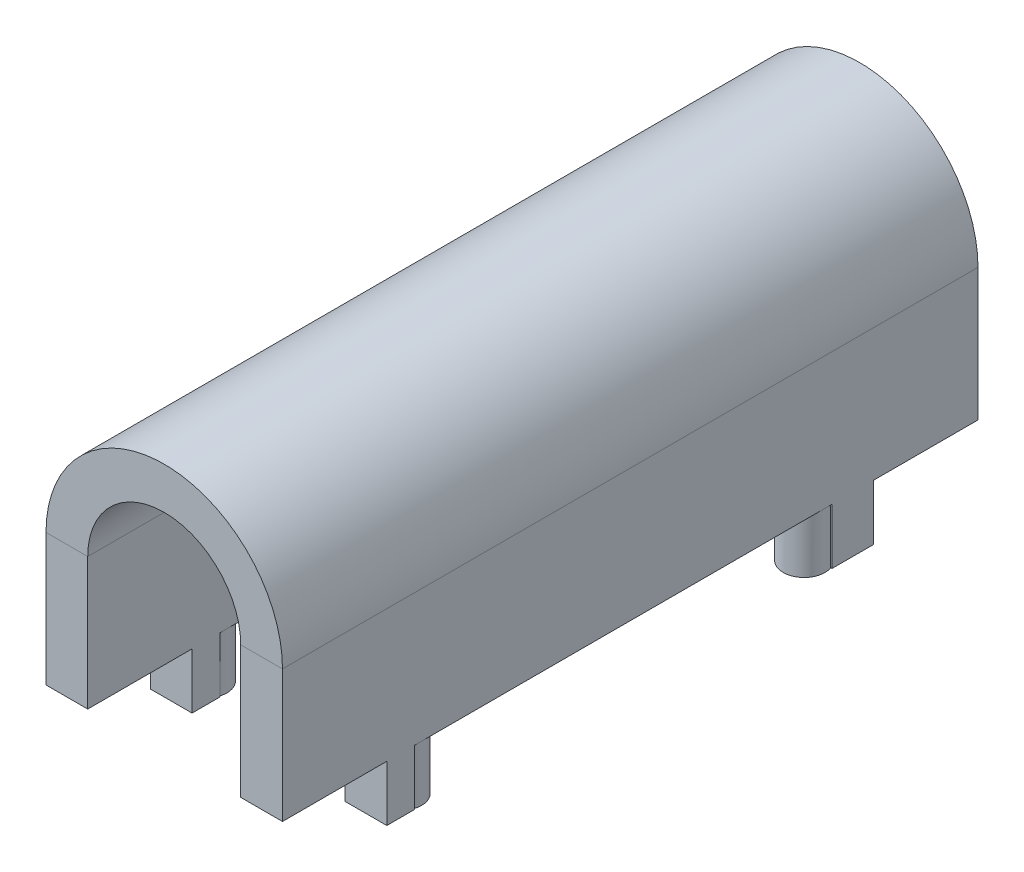
ISO-10303-21;
HEADER;
FILE_DESCRIPTION(('STEP AP214'),'2;1');
FILE_NAME('part.step','',(''),(''),'','','');
FILE_SCHEMA(('AUTOMOTIVE_DESIGN { 1 0 10303 214 1 1 1 1 }'));
ENDSEC;
DATA;
#1=APPLICATION_CONTEXT('core data for automotive mechanical design processes');
#2=APPLICATION_PROTOCOL_DEFINITION('international standard','automotive_design',2000,#1);
#3=PRODUCT_CONTEXT('',#1,'mechanical');
#4=PRODUCT('Part','Part','',(#3));
#5=PRODUCT_RELATED_PRODUCT_CATEGORY('part','',(#4));
#6=PRODUCT_DEFINITION_FORMATION('','',#4);
#7=PRODUCT_DEFINITION_CONTEXT('part definition',#1,'design');
#8=PRODUCT_DEFINITION('design','',#6,#7);
#9=PRODUCT_DEFINITION_SHAPE('','',#8);
#10=(LENGTH_UNIT() NAMED_UNIT(*) SI_UNIT(.MILLI.,.METRE.));
#11=(NAMED_UNIT(*) PLANE_ANGLE_UNIT() SI_UNIT($,.RADIAN.));
#12=(NAMED_UNIT(*) SI_UNIT($,.STERADIAN.) SOLID_ANGLE_UNIT());
#13=UNCERTAINTY_MEASURE_WITH_UNIT(LENGTH_MEASURE(1.E-05),#10,'distance_accuracy_value','');
#14=(GEOMETRIC_REPRESENTATION_CONTEXT(3) GLOBAL_UNCERTAINTY_ASSIGNED_CONTEXT((#13)) GLOBAL_UNIT_ASSIGNED_CONTEXT((#10,
#11,#12)) REPRESENTATION_CONTEXT('',''));
#15=CARTESIAN_POINT('',(0.,0.,0.));
#16=DIRECTION('',(0.,0.,1.));
#17=DIRECTION('',(1.,0.,0.));
#18=AXIS2_PLACEMENT_3D('',#15,#16,#17);
#19=CARTESIAN_POINT('',(5.75,-4.75,20.25));
#20=DIRECTION('',(0.,0.,1.));
#21=DIRECTION('',(1.,0.,0.));
#22=AXIS2_PLACEMENT_3D('',#19,#20,#21);
#23=PLANE('',#22);
#24=DIRECTION('',(0.,1.,0.));
#25=VECTOR('',#24,1.);
#26=CARTESIAN_POINT('',(4.20710678118655,-8.87132034355965,20.25));
#27=LINE('',#26,#25);
#28=CARTESIAN_POINT('',(4.20710678118655,-4.75,20.25));
#29=VERTEX_POINT('',#28);
#30=CARTESIAN_POINT('',(4.20710678118655,-6.75,20.25));
#31=VERTEX_POINT('',#30);
#32=EDGE_CURVE('E523',#29,#31,#27,.F.);
#33=ORIENTED_EDGE('',*,*,#32,.F.);
#34=DIRECTION('',(-1.,0.,0.));
#35=VECTOR('',#34,1.);
#36=CARTESIAN_POINT('',(5.75,-4.75,20.25));
#37=LINE('',#36,#35);
#38=CARTESIAN_POINT('',(4.25,-4.75,20.25));
#39=VERTEX_POINT('',#38);
#40=EDGE_CURVE('E455',#39,#29,#37,.T.);
#41=ORIENTED_EDGE('',*,*,#40,.F.);
#42=DIRECTION('',(0.,1.,0.));
#43=VECTOR('',#42,1.);
#44=CARTESIAN_POINT('',(4.25,-6.75,20.25));
#45=LINE('',#44,#43);
#46=CARTESIAN_POINT('',(4.25,-6.75,20.25));
#47=VERTEX_POINT('',#46);
#48=EDGE_CURVE('E327',#47,#39,#45,.T.);
#49=ORIENTED_EDGE('',*,*,#48,.F.);
#50=DIRECTION('',(-1.,0.,0.));
#51=VECTOR('',#50,1.);
#52=CARTESIAN_POINT('',(5.75,-6.75,20.25));
#53=LINE('',#52,#51);
#54=EDGE_CURVE('E58',#47,#31,#53,.T.);
#55=ORIENTED_EDGE('',*,*,#54,.T.);
#56=EDGE_LOOP('',(#33,#41,#49,#55));
#57=FACE_BOUND('',#56,.T.);
#58=ADVANCED_FACE('F35',(#57),#23,.F.);
#59=DIRECTION('',(0.,1.,0.));
#60=VECTOR('',#59,1.);
#61=CARTESIAN_POINT('',(2.79289321881345,-8.87132034355965,20.25));
#62=LINE('',#61,#60);
#63=CARTESIAN_POINT('',(2.79289321881345,-6.75,20.25));
#64=VERTEX_POINT('',#63);
#65=CARTESIAN_POINT('',(2.79289321881345,-4.75,20.25));
#66=VERTEX_POINT('',#65);
#67=EDGE_CURVE('E50',#64,#66,#62,.T.);
#68=ORIENTED_EDGE('',*,*,#67,.F.);
#69=CARTESIAN_POINT('',(2.75,-6.75,20.25));
#70=VERTEX_POINT('',#69);
#71=EDGE_CURVE('E449',#64,#70,#53,.T.);
#72=ORIENTED_EDGE('',*,*,#71,.T.);
#73=DIRECTION('',(0.,1.,0.));
#74=VECTOR('',#73,1.);
#75=CARTESIAN_POINT('',(2.75,-6.75,20.25));
#76=LINE('',#75,#74);
#77=CARTESIAN_POINT('',(2.75,-4.75,20.25));
#78=VERTEX_POINT('',#77);
#79=EDGE_CURVE('E444',#70,#78,#76,.T.);
#80=ORIENTED_EDGE('',*,*,#79,.T.);
#81=EDGE_CURVE('E273',#66,#78,#37,.T.);
#82=ORIENTED_EDGE('',*,*,#81,.F.);
#83=EDGE_LOOP('',(#68,#72,#80,#82));
#84=FACE_BOUND('',#83,.T.);
#85=ADVANCED_FACE('F639',(#84),#23,.F.);
#86=CARTESIAN_POINT('',(5.75,-4.75,5.25));
#87=DIRECTION('',(0.,1.,0.));
#88=DIRECTION('',(-1.,0.,0.));
#89=AXIS2_PLACEMENT_3D('',#86,#87,#88);
#90=PLANE('',#89);
#91=CARTESIAN_POINT('',(3.5,-4.75,20.));
#92=DIRECTION('',(0.,-1.,0.));
#93=DIRECTION('',(1.,0.,0.));
#94=AXIS2_PLACEMENT_3D('',#91,#92,#93);
#95=CIRCLE('',#94,0.750000000000002);
#96=CARTESIAN_POINT('',(4.25,-4.75,20.));
#97=VERTEX_POINT('',#96);
#98=EDGE_CURVE('E529',#97,#29,#95,.T.);
#99=ORIENTED_EDGE('',*,*,#98,.F.);
#100=DIRECTION('',(0.,0.,-1.));
#101=VECTOR('',#100,1.);
#102=CARTESIAN_POINT('',(4.25,-4.75,25.));
#103=LINE('',#102,#101);
#104=EDGE_CURVE('E324',#39,#97,#103,.T.);
#105=ORIENTED_EDGE('',*,*,#104,.F.);
#106=ORIENTED_EDGE('',*,*,#40,.T.);
#107=EDGE_LOOP('',(#99,#105,#106));
#108=FACE_BOUND('',#107,.T.);
#109=ADVANCED_FACE('F533',(#108),#90,.F.);
#110=CARTESIAN_POINT('',(3.5,-4.75,20.));
#111=DIRECTION('',(0.,1.,0.));
#112=DIRECTION('',(-1.,0.,0.));
#113=AXIS2_PLACEMENT_3D('',#110,#111,#112);
#114=CIRCLE('',#113,0.750000000000002);
#115=CARTESIAN_POINT('',(2.75,-4.75,20.));
#116=VERTEX_POINT('',#115);
#117=EDGE_CURVE('E11',#116,#97,#114,.F.);
#118=ORIENTED_EDGE('',*,*,#117,.F.);
#119=DIRECTION('',(0.,0.,-1.));
#120=VECTOR('',#119,1.);
#121=CARTESIAN_POINT('',(2.75,-4.75,25.));
#122=LINE('',#121,#120);
#123=CARTESIAN_POINT('',(2.75,-4.75,5.5));
#124=VERTEX_POINT('',#123);
#125=EDGE_CURVE('E278',#116,#124,#122,.T.);
#126=ORIENTED_EDGE('',*,*,#125,.T.);
#127=CARTESIAN_POINT('',(3.5,-4.75,5.5));
#128=DIRECTION('',(0.,-1.,0.));
#129=DIRECTION('',(1.,0.,0.));
#130=AXIS2_PLACEMENT_3D('',#127,#128,#129);
#131=CIRCLE('',#130,0.750000000000002);
#132=CARTESIAN_POINT('',(4.25,-4.75,5.5));
#133=VERTEX_POINT('',#132);
#134=EDGE_CURVE('E519',#133,#124,#131,.T.);
#135=ORIENTED_EDGE('',*,*,#134,.F.);
#136=EDGE_CURVE('E291',#97,#133,#103,.T.);
#137=ORIENTED_EDGE('',*,*,#136,.F.);
#138=EDGE_LOOP('',(#118,#126,#135,#137));
#139=FACE_BOUND('',#138,.T.);
#140=ADVANCED_FACE('F290',(#139),#90,.F.);
#141=CARTESIAN_POINT('',(2.79289321881345,-4.75,5.25));
#142=VERTEX_POINT('',#141);
#143=EDGE_CURVE('E521',#124,#142,#131,.T.);
#144=ORIENTED_EDGE('',*,*,#143,.F.);
#145=CARTESIAN_POINT('',(2.75,-4.75,5.25));
#146=VERTEX_POINT('',#145);
#147=EDGE_CURVE('E280',#124,#146,#122,.T.);
#148=ORIENTED_EDGE('',*,*,#147,.T.);
#149=DIRECTION('',(-1.,0.,0.));
#150=VECTOR('',#149,1.);
#151=CARTESIAN_POINT('',(5.75,-4.75,5.25));
#152=LINE('',#151,#150);
#153=EDGE_CURVE('E459',#142,#146,#152,.T.);
#154=ORIENTED_EDGE('',*,*,#153,.F.);
#155=EDGE_LOOP('',(#144,#148,#154));
#156=FACE_BOUND('',#155,.T.);
#157=ADVANCED_FACE('F815',(#156),#90,.F.);
#158=CARTESIAN_POINT('',(4.20710678118655,-4.75,5.25));
#159=VERTEX_POINT('',#158);
#160=EDGE_CURVE('E522',#159,#133,#131,.T.);
#161=ORIENTED_EDGE('',*,*,#160,.F.);
#162=CARTESIAN_POINT('',(4.25,-4.75,5.25));
#163=VERTEX_POINT('',#162);
#164=EDGE_CURVE('E461',#163,#159,#152,.T.);
#165=ORIENTED_EDGE('',*,*,#164,.F.);
#166=EDGE_CURVE('E326',#133,#163,#103,.T.);
#167=ORIENTED_EDGE('',*,*,#166,.F.);
#168=EDGE_LOOP('',(#161,#165,#167));
#169=FACE_BOUND('',#168,.T.);
#170=ADVANCED_FACE('F808',(#169),#90,.F.);
#171=CARTESIAN_POINT('',(5.75,-6.75,5.25));
#172=DIRECTION('',(0.,0.,-1.));
#173=DIRECTION('',(-1.,0.,0.));
#174=AXIS2_PLACEMENT_3D('',#171,#172,#173);
#175=PLANE('',#174);
#176=DIRECTION('',(0.,1.,0.));
#177=VECTOR('',#176,1.);
#178=CARTESIAN_POINT('',(2.79289321881345,-8.87132034355965,5.25));
#179=LINE('',#178,#177);
#180=CARTESIAN_POINT('',(2.79289321881345,-6.75,5.25));
#181=VERTEX_POINT('',#180);
#182=EDGE_CURVE('E297',#142,#181,#179,.F.);
#183=ORIENTED_EDGE('',*,*,#182,.F.);
#184=ORIENTED_EDGE('',*,*,#153,.T.);
#185=DIRECTION('',(0.,-1.,0.));
#186=VECTOR('',#185,1.);
#187=CARTESIAN_POINT('',(2.75,-6.75,5.25));
#188=LINE('',#187,#186);
#189=CARTESIAN_POINT('',(2.75,-6.75,5.25));
#190=VERTEX_POINT('',#189);
#191=EDGE_CURVE('E434',#146,#190,#188,.T.);
#192=ORIENTED_EDGE('',*,*,#191,.T.);
#193=DIRECTION('',(-1.,0.,0.));
#194=VECTOR('',#193,1.);
#195=CARTESIAN_POINT('',(5.75,-6.75,5.25));
#196=LINE('',#195,#194);
#197=EDGE_CURVE('E465',#181,#190,#196,.T.);
#198=ORIENTED_EDGE('',*,*,#197,.F.);
#199=EDGE_LOOP('',(#183,#184,#192,#198));
#200=FACE_BOUND('',#199,.T.);
#201=ADVANCED_FACE('F804',(#200),#175,.F.);
#202=DIRECTION('',(0.,1.,0.));
#203=VECTOR('',#202,1.);
#204=CARTESIAN_POINT('',(4.20710678118655,-8.87132034355965,5.25));
#205=LINE('',#204,#203);
#206=CARTESIAN_POINT('',(4.20710678118655,-6.75,5.25));
#207=VERTEX_POINT('',#206);
#208=EDGE_CURVE('E299',#207,#159,#205,.T.);
#209=ORIENTED_EDGE('',*,*,#208,.F.);
#210=CARTESIAN_POINT('',(4.25,-6.75,5.25));
#211=VERTEX_POINT('',#210);
#212=EDGE_CURVE('E446',#211,#207,#196,.T.);
#213=ORIENTED_EDGE('',*,*,#212,.F.);
#214=DIRECTION('',(0.,-1.,0.));
#215=VECTOR('',#214,1.);
#216=CARTESIAN_POINT('',(4.25,-6.75,5.25));
#217=LINE('',#216,#215);
#218=EDGE_CURVE('E321',#163,#211,#217,.T.);
#219=ORIENTED_EDGE('',*,*,#218,.F.);
#220=ORIENTED_EDGE('',*,*,#164,.T.);
#221=EDGE_LOOP('',(#209,#213,#219,#220));
#222=FACE_BOUND('',#221,.T.);
#223=ADVANCED_FACE('F634',(#222),#175,.F.);
#224=CARTESIAN_POINT('',(-3.5,-4.75,5.5));
#225=DIRECTION('',(0.,-1.,0.));
#226=DIRECTION('',(1.,0.,0.));
#227=AXIS2_PLACEMENT_3D('',#224,#225,#226);
#228=CIRCLE('',#227,0.75);
#229=CARTESIAN_POINT('',(-4.25,-4.75,5.5));
#230=VERTEX_POINT('',#229);
#231=CARTESIAN_POINT('',(-4.20710678118655,-4.75,5.25));
#232=VERTEX_POINT('',#231);
#233=EDGE_CURVE('E515',#230,#232,#228,.T.);
#234=ORIENTED_EDGE('',*,*,#233,.F.);
#235=DIRECTION('',(0.,0.,-1.));
#236=VECTOR('',#235,1.);
#237=CARTESIAN_POINT('',(-4.25,-4.75,5.25));
#238=LINE('',#237,#236);
#239=CARTESIAN_POINT('',(-4.25,-4.75,5.25));
#240=VERTEX_POINT('',#239);
#241=EDGE_CURVE('E474',#230,#240,#238,.T.);
#242=ORIENTED_EDGE('',*,*,#241,.T.);
#243=EDGE_CURVE('E460',#232,#240,#152,.T.);
#244=ORIENTED_EDGE('',*,*,#243,.F.);
#245=EDGE_LOOP('',(#234,#242,#244));
#246=FACE_BOUND('',#245,.T.);
#247=ADVANCED_FACE('F616',(#246),#90,.F.);
#248=CARTESIAN_POINT('',(-2.79289321881345,-4.75,5.25));
#249=VERTEX_POINT('',#248);
#250=CARTESIAN_POINT('',(-2.75,-4.75,5.5));
#251=VERTEX_POINT('',#250);
#252=EDGE_CURVE('E516',#249,#251,#228,.T.);
#253=ORIENTED_EDGE('',*,*,#252,.F.);
#254=CARTESIAN_POINT('',(-2.75,-4.75,5.25));
#255=VERTEX_POINT('',#254);
#256=EDGE_CURVE('E456',#255,#249,#152,.T.);
#257=ORIENTED_EDGE('',*,*,#256,.F.);
#258=DIRECTION('',(0.,0.,1.));
#259=VECTOR('',#258,1.);
#260=CARTESIAN_POINT('',(-2.75,-4.75,25.));
#261=LINE('',#260,#259);
#262=EDGE_CURVE('E437',#255,#251,#261,.T.);
#263=ORIENTED_EDGE('',*,*,#262,.T.);
#264=EDGE_LOOP('',(#253,#257,#263));
#265=FACE_BOUND('',#264,.T.);
#266=ADVANCED_FACE('F627',(#265),#90,.F.);
#267=DIRECTION('',(0.,1.,0.));
#268=VECTOR('',#267,1.);
#269=CARTESIAN_POINT('',(-4.20710678118655,-8.87132034355965,5.25));
#270=LINE('',#269,#268);
#271=CARTESIAN_POINT('',(-4.20710678118655,-6.75,5.25));
#272=VERTEX_POINT('',#271);
#273=EDGE_CURVE('E303',#232,#272,#270,.F.);
#274=ORIENTED_EDGE('',*,*,#273,.F.);
#275=ORIENTED_EDGE('',*,*,#243,.T.);
#276=DIRECTION('',(0.,-1.,0.));
#277=VECTOR('',#276,1.);
#278=CARTESIAN_POINT('',(-4.25,-6.75,5.25));
#279=LINE('',#278,#277);
#280=CARTESIAN_POINT('',(-4.25,-6.75,5.25));
#281=VERTEX_POINT('',#280);
#282=EDGE_CURVE('E467',#240,#281,#279,.T.);
#283=ORIENTED_EDGE('',*,*,#282,.T.);
#284=EDGE_CURVE('E466',#272,#281,#196,.T.);
#285=ORIENTED_EDGE('',*,*,#284,.F.);
#286=EDGE_LOOP('',(#274,#275,#283,#285));
#287=FACE_BOUND('',#286,.T.);
#288=ADVANCED_FACE('F612',(#287),#175,.F.);
#289=DIRECTION('',(0.,1.,0.));
#290=VECTOR('',#289,1.);
#291=CARTESIAN_POINT('',(-2.79289321881345,-8.87132034355965,5.25));
#292=LINE('',#291,#290);
#293=CARTESIAN_POINT('',(-2.79289321881345,-6.75,5.25));
#294=VERTEX_POINT('',#293);
#295=EDGE_CURVE('E308',#294,#249,#292,.T.);
#296=ORIENTED_EDGE('',*,*,#295,.F.);
#297=CARTESIAN_POINT('',(-2.75,-6.75,5.25));
#298=VERTEX_POINT('',#297);
#299=EDGE_CURVE('E462',#298,#294,#196,.T.);
#300=ORIENTED_EDGE('',*,*,#299,.F.);
#301=DIRECTION('',(0.,1.,0.));
#302=VECTOR('',#301,1.);
#303=CARTESIAN_POINT('',(-2.75,0.,5.25));
#304=LINE('',#303,#302);
#305=EDGE_CURVE('E432',#298,#255,#304,.T.);
#306=ORIENTED_EDGE('',*,*,#305,.T.);
#307=ORIENTED_EDGE('',*,*,#256,.T.);
#308=EDGE_LOOP('',(#296,#300,#306,#307));
#309=FACE_BOUND('',#308,.T.);
#310=ADVANCED_FACE('F625',(#309),#175,.F.);
#311=CARTESIAN_POINT('',(-3.5,-4.75,20.));
#312=DIRECTION('',(0.,-1.,0.));
#313=DIRECTION('',(1.,0.,0.));
#314=AXIS2_PLACEMENT_3D('',#311,#312,#313);
#315=CIRCLE('',#314,0.750000000000001);
#316=CARTESIAN_POINT('',(-2.75,-4.75,20.));
#317=VERTEX_POINT('',#316);
#318=CARTESIAN_POINT('',(-2.79289321881345,-4.75,20.25));
#319=VERTEX_POINT('',#318);
#320=EDGE_CURVE('E506',#317,#319,#315,.T.);
#321=ORIENTED_EDGE('',*,*,#320,.F.);
#322=CARTESIAN_POINT('',(-2.75,-4.75,20.25));
#323=VERTEX_POINT('',#322);
#324=EDGE_CURVE('E277',#317,#323,#261,.T.);
#325=ORIENTED_EDGE('',*,*,#324,.T.);
#326=EDGE_CURVE('E451',#323,#319,#37,.T.);
#327=ORIENTED_EDGE('',*,*,#326,.T.);
#328=EDGE_LOOP('',(#321,#325,#327));
#329=FACE_BOUND('',#328,.T.);
#330=ADVANCED_FACE('F623',(#329),#90,.F.);
#331=EDGE_CURVE('E513',#251,#230,#228,.T.);
#332=ORIENTED_EDGE('',*,*,#331,.F.);
#333=EDGE_CURVE('E439',#251,#317,#261,.T.);
#334=ORIENTED_EDGE('',*,*,#333,.T.);
#335=CARTESIAN_POINT('',(-4.25,-4.75,20.));
#336=VERTEX_POINT('',#335);
#337=EDGE_CURVE('E510',#336,#317,#315,.T.);
#338=ORIENTED_EDGE('',*,*,#337,.F.);
#339=EDGE_CURVE('E473',#336,#230,#238,.T.);
#340=ORIENTED_EDGE('',*,*,#339,.T.);
#341=EDGE_LOOP('',(#332,#334,#338,#340));
#342=FACE_BOUND('',#341,.T.);
#343=ADVANCED_FACE('F619',(#342),#90,.F.);
#344=DIRECTION('',(0.,1.,0.));
#345=VECTOR('',#344,1.);
#346=CARTESIAN_POINT('',(-2.79289321881345,-8.87132034355965,20.25));
#347=LINE('',#346,#345);
#348=CARTESIAN_POINT('',(-2.79289321881345,-6.75,20.25));
#349=VERTEX_POINT('',#348);
#350=EDGE_CURVE('E310',#319,#349,#347,.F.);
#351=ORIENTED_EDGE('',*,*,#350,.F.);
#352=ORIENTED_EDGE('',*,*,#326,.F.);
#353=DIRECTION('',(0.,-1.,0.));
#354=VECTOR('',#353,1.);
#355=CARTESIAN_POINT('',(-2.75,0.,20.25));
#356=LINE('',#355,#354);
#357=CARTESIAN_POINT('',(-2.75,-6.75,20.25));
#358=VERTEX_POINT('',#357);
#359=EDGE_CURVE('E441',#323,#358,#356,.T.);
#360=ORIENTED_EDGE('',*,*,#359,.T.);
#361=EDGE_CURVE('E447',#358,#349,#53,.T.);
#362=ORIENTED_EDGE('',*,*,#361,.T.);
#363=EDGE_LOOP('',(#351,#352,#360,#362));
#364=FACE_BOUND('',#363,.T.);
#365=ADVANCED_FACE('F560',(#364),#23,.F.);
#366=DIRECTION('',(0.,1.,0.));
#367=VECTOR('',#366,1.);
#368=CARTESIAN_POINT('',(-4.20710678118655,-8.87132034355965,20.25));
#369=LINE('',#368,#367);
#370=CARTESIAN_POINT('',(-4.20710678118655,-6.75,20.25));
#371=VERTEX_POINT('',#370);
#372=CARTESIAN_POINT('',(-4.20710678118655,-4.75,20.25));
#373=VERTEX_POINT('',#372);
#374=EDGE_CURVE('E313',#371,#373,#369,.T.);
#375=ORIENTED_EDGE('',*,*,#374,.F.);
#376=CARTESIAN_POINT('',(-4.25,-6.75,20.25));
#377=VERTEX_POINT('',#376);
#378=EDGE_CURVE('E450',#371,#377,#53,.T.);
#379=ORIENTED_EDGE('',*,*,#378,.T.);
#380=DIRECTION('',(0.,1.,0.));
#381=VECTOR('',#380,1.);
#382=CARTESIAN_POINT('',(-4.25,-4.75,20.25));
#383=LINE('',#382,#381);
#384=CARTESIAN_POINT('',(-4.25,-4.75,20.25));
#385=VERTEX_POINT('',#384);
#386=EDGE_CURVE('E475',#377,#385,#383,.T.);
#387=ORIENTED_EDGE('',*,*,#386,.T.);
#388=EDGE_CURVE('E454',#373,#385,#37,.T.);
#389=ORIENTED_EDGE('',*,*,#388,.F.);
#390=EDGE_LOOP('',(#375,#379,#387,#389));
#391=FACE_BOUND('',#390,.T.);
#392=ADVANCED_FACE('F539',(#391),#23,.F.);
#393=CARTESIAN_POINT('',(-2.75,-6.75,25.));
#394=DIRECTION('',(0.,-1.,0.));
#395=DIRECTION('',(0.,0.,-1.));
#396=AXIS2_PLACEMENT_3D('',#393,#394,#395);
#397=PLANE('',#396);
#398=ORIENTED_EDGE('',*,*,#299,.T.);
#399=CARTESIAN_POINT('',(-3.5,-6.75,5.5));
#400=DIRECTION('',(0.,-1.,0.));
#401=DIRECTION('',(0.,0.,-1.));
#402=AXIS2_PLACEMENT_3D('',#399,#400,#401);
#403=CIRCLE('',#402,0.75);
#404=EDGE_CURVE('E511',#294,#272,#403,.T.);
#405=ORIENTED_EDGE('',*,*,#404,.T.);
#406=ORIENTED_EDGE('',*,*,#284,.T.);
#407=DIRECTION('',(0.,0.,-1.));
#408=VECTOR('',#407,1.);
#409=CARTESIAN_POINT('',(-4.25,-6.75,25.));
#410=LINE('',#409,#408);
#411=CARTESIAN_POINT('',(-4.25,-6.75,3.75));
#412=VERTEX_POINT('',#411);
#413=EDGE_CURVE('E349',#281,#412,#410,.T.);
#414=ORIENTED_EDGE('',*,*,#413,.T.);
#415=DIRECTION('',(-1.,0.,0.));
#416=VECTOR('',#415,1.);
#417=CARTESIAN_POINT('',(5.75,-6.75,3.75));
#418=LINE('',#417,#416);
#419=CARTESIAN_POINT('',(-2.75,-6.75,3.75));
#420=VERTEX_POINT('',#419);
#421=EDGE_CURVE('E418',#420,#412,#418,.T.);
#422=ORIENTED_EDGE('',*,*,#421,.F.);
#423=DIRECTION('',(0.,0.,-1.));
#424=VECTOR('',#423,1.);
#425=CARTESIAN_POINT('',(-2.75,-6.75,25.));
#426=LINE('',#425,#424);
#427=EDGE_CURVE('E352',#298,#420,#426,.T.);
#428=ORIENTED_EDGE('',*,*,#427,.F.);
#429=EDGE_LOOP('',(#398,#405,#406,#414,#422,#428));
#430=FACE_BOUND('',#429,.T.);
#431=ADVANCED_FACE('F606',(#430),#397,.T.);
#432=CARTESIAN_POINT('',(4.25,-6.75,25.));
#433=DIRECTION('',(0.,-1.,0.));
#434=DIRECTION('',(0.,0.,-1.));
#435=AXIS2_PLACEMENT_3D('',#432,#433,#434);
#436=PLANE('',#435);
#437=ORIENTED_EDGE('',*,*,#212,.T.);
#438=CARTESIAN_POINT('',(3.5,-6.75,5.5));
#439=DIRECTION('',(0.,-1.,0.));
#440=DIRECTION('',(0.,0.,-1.));
#441=AXIS2_PLACEMENT_3D('',#438,#439,#440);
#442=CIRCLE('',#441,0.750000000000002);
#443=EDGE_CURVE('E517',#207,#181,#442,.T.);
#444=ORIENTED_EDGE('',*,*,#443,.T.);
#445=ORIENTED_EDGE('',*,*,#197,.T.);
#446=DIRECTION('',(0.,0.,-1.));
#447=VECTOR('',#446,1.);
#448=CARTESIAN_POINT('',(2.75,-6.75,25.));
#449=LINE('',#448,#447);
#450=CARTESIAN_POINT('',(2.75,-6.75,3.75));
#451=VERTEX_POINT('',#450);
#452=EDGE_CURVE('E362',#190,#451,#449,.T.);
#453=ORIENTED_EDGE('',*,*,#452,.T.);
#454=CARTESIAN_POINT('',(4.25,-6.75,3.75));
#455=VERTEX_POINT('',#454);
#456=EDGE_CURVE('E421',#455,#451,#418,.T.);
#457=ORIENTED_EDGE('',*,*,#456,.F.);
#458=DIRECTION('',(0.,0.,-1.));
#459=VECTOR('',#458,1.);
#460=CARTESIAN_POINT('',(4.25,-6.75,25.));
#461=LINE('',#460,#459);
#462=EDGE_CURVE('E365',#211,#455,#461,.T.);
#463=ORIENTED_EDGE('',*,*,#462,.F.);
#464=EDGE_LOOP('',(#437,#444,#445,#453,#457,#463));
#465=FACE_BOUND('',#464,.T.);
#466=ADVANCED_FACE('F651',(#465),#436,.T.);
#467=CARTESIAN_POINT('',(4.25,0.,25.));
#468=DIRECTION('',(0.,0.,1.));
#469=DIRECTION('',(1.,0.,0.));
#470=AXIS2_PLACEMENT_3D('',#467,#468,#469);
#471=PLANE('',#470);
#472=DIRECTION('',(-1.,0.,0.));
#473=VECTOR('',#472,1.);
#474=CARTESIAN_POINT('',(4.25,0.,25.));
#475=LINE('',#474,#473);
#476=CARTESIAN_POINT('',(4.25,0.,25.));
#477=VERTEX_POINT('',#476);
#478=CARTESIAN_POINT('',(2.75,0.,25.));
#479=VERTEX_POINT('',#478);
#480=EDGE_CURVE('E336',#477,#479,#475,.T.);
#481=ORIENTED_EDGE('',*,*,#480,.F.);
#482=CARTESIAN_POINT('',(0.,0.,25.));
#483=DIRECTION('',(0.,0.,1.));
#484=DIRECTION('',(1.,0.,0.));
#485=AXIS2_PLACEMENT_3D('',#482,#483,#484);
#486=CIRCLE('',#485,4.25);
#487=CARTESIAN_POINT('',(-4.25,0.,25.));
#488=VERTEX_POINT('',#487);
#489=EDGE_CURVE('E372',#477,#488,#486,.T.);
#490=ORIENTED_EDGE('',*,*,#489,.T.);
#491=DIRECTION('',(-1.,0.,0.));
#492=VECTOR('',#491,1.);
#493=CARTESIAN_POINT('',(-2.75,0.,25.));
#494=LINE('',#493,#492);
#495=CARTESIAN_POINT('',(-2.75,0.,25.));
#496=VERTEX_POINT('',#495);
#497=EDGE_CURVE('E339',#496,#488,#494,.T.);
#498=ORIENTED_EDGE('',*,*,#497,.F.);
#499=CARTESIAN_POINT('',(0.,0.,25.));
#500=DIRECTION('',(0.,0.,1.));
#501=DIRECTION('',(1.,0.,0.));
#502=AXIS2_PLACEMENT_3D('',#499,#500,#501);
#503=CIRCLE('',#502,2.75);
#504=EDGE_CURVE('E397',#479,#496,#503,.T.);
#505=ORIENTED_EDGE('',*,*,#504,.F.);
#506=EDGE_LOOP('',(#481,#490,#498,#505));
#507=FACE_BOUND('',#506,.T.);
#508=ADVANCED_FACE('F37',(#507),#471,.T.);
#509=CARTESIAN_POINT('',(-2.75,0.,25.));
#510=DIRECTION('',(0.,0.,1.));
#511=DIRECTION('',(1.,0.,0.));
#512=AXIS2_PLACEMENT_3D('',#509,#510,#511);
#513=PLANE('',#512);
#514=DIRECTION('',(-1.,0.,0.));
#515=VECTOR('',#514,1.);
#516=CARTESIAN_POINT('',(5.75,-4.75,25.));
#517=LINE('',#516,#515);
#518=CARTESIAN_POINT('',(4.25,-4.75,25.));
#519=VERTEX_POINT('',#518);
#520=CARTESIAN_POINT('',(2.75,-4.75,25.));
#521=VERTEX_POINT('',#520);
#522=EDGE_CURVE('E490',#519,#521,#517,.T.);
#523=ORIENTED_EDGE('',*,*,#522,.F.);
#524=DIRECTION('',(0.,1.,0.));
#525=VECTOR('',#524,1.);
#526=CARTESIAN_POINT('',(4.25,-6.75,25.));
#527=LINE('',#526,#525);
#528=EDGE_CURVE('E393',#519,#477,#527,.T.);
#529=ORIENTED_EDGE('',*,*,#528,.T.);
#530=ORIENTED_EDGE('',*,*,#480,.T.);
#531=DIRECTION('',(0.,1.,0.));
#532=VECTOR('',#531,1.);
#533=CARTESIAN_POINT('',(2.75,-6.75,25.));
#534=LINE('',#533,#532);
#535=EDGE_CURVE('E395',#521,#479,#534,.T.);
#536=ORIENTED_EDGE('',*,*,#535,.F.);
#537=EDGE_LOOP('',(#523,#529,#530,#536));
#538=FACE_BOUND('',#537,.T.);
#539=ADVANCED_FACE('F674',(#538),#513,.T.);
#540=CARTESIAN_POINT('',(-4.25,0.,0.));
#541=DIRECTION('',(0.,0.,-1.));
#542=DIRECTION('',(-1.,0.,0.));
#543=AXIS2_PLACEMENT_3D('',#540,#541,#542);
#544=PLANE('',#543);
#545=DIRECTION('',(1.,0.,0.));
#546=VECTOR('',#545,1.);
#547=CARTESIAN_POINT('',(-4.25,0.,0.));
#548=LINE('',#547,#546);
#549=CARTESIAN_POINT('',(-4.25,0.,0.));
#550=VERTEX_POINT('',#549);
#551=CARTESIAN_POINT('',(-2.75,0.,0.));
#552=VERTEX_POINT('',#551);
#553=EDGE_CURVE('E341',#550,#552,#548,.T.);
#554=ORIENTED_EDGE('',*,*,#553,.F.);
#555=CARTESIAN_POINT('',(0.,0.,0.));
#556=DIRECTION('',(0.,0.,1.));
#557=DIRECTION('',(1.,0.,0.));
#558=AXIS2_PLACEMENT_3D('',#555,#556,#557);
#559=CIRCLE('',#558,4.25);
#560=CARTESIAN_POINT('',(4.25,0.,0.));
#561=VERTEX_POINT('',#560);
#562=EDGE_CURVE('E373',#561,#550,#559,.T.);
#563=ORIENTED_EDGE('',*,*,#562,.F.);
#564=DIRECTION('',(1.,0.,0.));
#565=VECTOR('',#564,1.);
#566=CARTESIAN_POINT('',(2.75,0.,0.));
#567=LINE('',#566,#565);
#568=CARTESIAN_POINT('',(2.75,0.,0.));
#569=VERTEX_POINT('',#568);
#570=EDGE_CURVE('E343',#569,#561,#567,.T.);
#571=ORIENTED_EDGE('',*,*,#570,.F.);
#572=CARTESIAN_POINT('',(0.,0.,0.));
#573=DIRECTION('',(0.,0.,1.));
#574=DIRECTION('',(1.,0.,0.));
#575=AXIS2_PLACEMENT_3D('',#572,#573,#574);
#576=CIRCLE('',#575,2.75);
#577=EDGE_CURVE('E381',#569,#552,#576,.T.);
#578=ORIENTED_EDGE('',*,*,#577,.T.);
#579=EDGE_LOOP('',(#554,#563,#571,#578));
#580=FACE_BOUND('',#579,.T.);
#581=ADVANCED_FACE('F670',(#580),#544,.T.);
#582=CARTESIAN_POINT('',(2.75,0.,0.));
#583=DIRECTION('',(0.,0.,-1.));
#584=DIRECTION('',(-1.,0.,0.));
#585=AXIS2_PLACEMENT_3D('',#582,#583,#584);
#586=PLANE('',#585);
#587=DIRECTION('',(-1.,0.,0.));
#588=VECTOR('',#587,1.);
#589=CARTESIAN_POINT('',(5.75,-4.75,0.));
#590=LINE('',#589,#588);
#591=CARTESIAN_POINT('',(-2.75,-4.75,0.));
#592=VERTEX_POINT('',#591);
#593=CARTESIAN_POINT('',(-4.25,-4.75,0.));
#594=VERTEX_POINT('',#593);
#595=EDGE_CURVE('E417',#592,#594,#590,.T.);
#596=ORIENTED_EDGE('',*,*,#595,.T.);
#597=DIRECTION('',(0.,-1.,0.));
#598=VECTOR('',#597,1.);
#599=CARTESIAN_POINT('',(-4.25,0.,0.));
#600=LINE('',#599,#598);
#601=EDGE_CURVE('E387',#550,#594,#600,.T.);
#602=ORIENTED_EDGE('',*,*,#601,.F.);
#603=ORIENTED_EDGE('',*,*,#553,.T.);
#604=DIRECTION('',(0.,-1.,0.));
#605=VECTOR('',#604,1.);
#606=CARTESIAN_POINT('',(-2.75,0.,0.));
#607=LINE('',#606,#605);
#608=EDGE_CURVE('E384',#552,#592,#607,.T.);
#609=ORIENTED_EDGE('',*,*,#608,.T.);
#610=EDGE_LOOP('',(#596,#602,#603,#609));
#611=FACE_BOUND('',#610,.T.);
#612=ADVANCED_FACE('F593',(#611),#586,.T.);
#613=CARTESIAN_POINT('',(-4.25,0.,25.));
#614=DIRECTION('',(1.,0.,0.));
#615=DIRECTION('',(0.,1.,0.));
#616=AXIS2_PLACEMENT_3D('',#613,#614,#615);
#617=PLANE('',#616);
#618=CARTESIAN_POINT('',(-4.25,-6.75,21.25));
#619=VERTEX_POINT('',#618);
#620=EDGE_CURVE('E346',#619,#377,#410,.T.);
#621=ORIENTED_EDGE('',*,*,#620,.F.);
#622=DIRECTION('',(0.,-1.,0.));
#623=VECTOR('',#622,1.);
#624=CARTESIAN_POINT('',(-4.25,-6.75,21.25));
#625=LINE('',#624,#623);
#626=CARTESIAN_POINT('',(-4.25,-4.75,21.25));
#627=VERTEX_POINT('',#626);
#628=EDGE_CURVE('E493',#627,#619,#625,.T.);
#629=ORIENTED_EDGE('',*,*,#628,.F.);
#630=DIRECTION('',(0.,0.,-1.));
#631=VECTOR('',#630,1.);
#632=CARTESIAN_POINT('',(-4.25,-4.75,21.25));
#633=LINE('',#632,#631);
#634=CARTESIAN_POINT('',(-4.25,-4.75,25.));
#635=VERTEX_POINT('',#634);
#636=EDGE_CURVE('E500',#635,#627,#633,.T.);
#637=ORIENTED_EDGE('',*,*,#636,.F.);
#638=DIRECTION('',(0.,-1.,0.));
#639=VECTOR('',#638,1.);
#640=CARTESIAN_POINT('',(-4.25,0.,25.));
#641=LINE('',#640,#639);
#642=EDGE_CURVE('E376',#488,#635,#641,.T.);
#643=ORIENTED_EDGE('',*,*,#642,.F.);
#644=DIRECTION('',(0.,0.,-1.));
#645=VECTOR('',#644,1.);
#646=CARTESIAN_POINT('',(-4.25,0.,25.));
#647=LINE('',#646,#645);
#648=EDGE_CURVE('E369',#488,#550,#647,.T.);
#649=ORIENTED_EDGE('',*,*,#648,.T.);
#650=ORIENTED_EDGE('',*,*,#601,.T.);
#651=DIRECTION('',(0.,0.,-1.));
#652=VECTOR('',#651,1.);
#653=CARTESIAN_POINT('',(-4.25,-4.75,0.));
#654=LINE('',#653,#652);
#655=CARTESIAN_POINT('',(-4.25,-4.75,3.75));
#656=VERTEX_POINT('',#655);
#657=EDGE_CURVE('E422',#656,#594,#654,.T.);
#658=ORIENTED_EDGE('',*,*,#657,.F.);
#659=DIRECTION('',(0.,1.,0.));
#660=VECTOR('',#659,1.);
#661=CARTESIAN_POINT('',(-4.25,-4.75,3.75));
#662=LINE('',#661,#660);
#663=EDGE_CURVE('E429',#412,#656,#662,.T.);
#664=ORIENTED_EDGE('',*,*,#663,.F.);
#665=ORIENTED_EDGE('',*,*,#413,.F.);
#666=ORIENTED_EDGE('',*,*,#282,.F.);
#667=ORIENTED_EDGE('',*,*,#241,.F.);
#668=ORIENTED_EDGE('',*,*,#339,.F.);
#669=EDGE_CURVE('E470',#385,#336,#238,.T.);
#670=ORIENTED_EDGE('',*,*,#669,.F.);
#671=ORIENTED_EDGE('',*,*,#386,.F.);
#672=EDGE_LOOP('',(#621,#629,#637,#643,#649,#650,#658,#664,#665,#666,#667,#668,#670,#671));
#673=FACE_BOUND('',#672,.T.);
#674=ADVANCED_FACE('F549',(#673),#617,.F.);
#675=ORIENTED_EDGE('',*,*,#378,.F.);
#676=CARTESIAN_POINT('',(-3.5,-6.75,20.));
#677=DIRECTION('',(0.,-1.,0.));
#678=DIRECTION('',(0.,0.,-1.));
#679=AXIS2_PLACEMENT_3D('',#676,#677,#678);
#680=CIRCLE('',#679,0.750000000000001);
#681=EDGE_CURVE('E503',#371,#349,#680,.T.);
#682=ORIENTED_EDGE('',*,*,#681,.T.);
#683=ORIENTED_EDGE('',*,*,#361,.F.);
#684=CARTESIAN_POINT('',(-2.75,-6.75,21.25));
#685=VERTEX_POINT('',#684);
#686=EDGE_CURVE('E350',#685,#358,#426,.T.);
#687=ORIENTED_EDGE('',*,*,#686,.F.);
#688=DIRECTION('',(-1.,0.,0.));
#689=VECTOR('',#688,1.);
#690=CARTESIAN_POINT('',(5.75,-6.75,21.25));
#691=LINE('',#690,#689);
#692=EDGE_CURVE('E496',#685,#619,#691,.T.);
#693=ORIENTED_EDGE('',*,*,#692,.T.);
#694=ORIENTED_EDGE('',*,*,#620,.T.);
#695=EDGE_LOOP('',(#675,#682,#683,#687,#693,#694));
#696=FACE_BOUND('',#695,.T.);
#697=ADVANCED_FACE('F545',(#696),#397,.T.);
#698=CARTESIAN_POINT('',(-2.75,0.,25.));
#699=DIRECTION('',(1.,0.,0.));
#700=DIRECTION('',(0.,1.,0.));
#701=AXIS2_PLACEMENT_3D('',#698,#699,#700);
#702=PLANE('',#701);
#703=DIRECTION('',(0.,1.,0.));
#704=VECTOR('',#703,1.);
#705=CARTESIAN_POINT('',(-2.75,0.,21.25));
#706=LINE('',#705,#704);
#707=CARTESIAN_POINT('',(-2.75,-4.75,21.25));
#708=VERTEX_POINT('',#707);
#709=EDGE_CURVE('E478',#685,#708,#706,.T.);
#710=ORIENTED_EDGE('',*,*,#709,.F.);
#711=ORIENTED_EDGE('',*,*,#686,.T.);
#712=ORIENTED_EDGE('',*,*,#359,.F.);
#713=ORIENTED_EDGE('',*,*,#324,.F.);
#714=ORIENTED_EDGE('',*,*,#333,.F.);
#715=ORIENTED_EDGE('',*,*,#262,.F.);
#716=ORIENTED_EDGE('',*,*,#305,.F.);
#717=ORIENTED_EDGE('',*,*,#427,.T.);
#718=DIRECTION('',(0.,-1.,0.));
#719=VECTOR('',#718,1.);
#720=CARTESIAN_POINT('',(-2.75,0.,3.75));
#721=LINE('',#720,#719);
#722=CARTESIAN_POINT('',(-2.75,-4.75,3.75));
#723=VERTEX_POINT('',#722);
#724=EDGE_CURVE('E390',#723,#420,#721,.T.);
#725=ORIENTED_EDGE('',*,*,#724,.F.);
#726=DIRECTION('',(0.,0.,1.));
#727=VECTOR('',#726,1.);
#728=CARTESIAN_POINT('',(-2.75,-4.75,25.));
#729=LINE('',#728,#727);
#730=EDGE_CURVE('E409',#592,#723,#729,.T.);
#731=ORIENTED_EDGE('',*,*,#730,.F.);
#732=ORIENTED_EDGE('',*,*,#608,.F.);
#733=DIRECTION('',(0.,0.,-1.));
#734=VECTOR('',#733,1.);
#735=CARTESIAN_POINT('',(-2.75,0.,25.));
#736=LINE('',#735,#734);
#737=EDGE_CURVE('E353',#496,#552,#736,.T.);
#738=ORIENTED_EDGE('',*,*,#737,.F.);
#739=DIRECTION('',(0.,-1.,0.));
#740=VECTOR('',#739,1.);
#741=CARTESIAN_POINT('',(-2.75,0.,25.));
#742=LINE('',#741,#740);
#743=CARTESIAN_POINT('',(-2.75,-4.75,25.));
#744=VERTEX_POINT('',#743);
#745=EDGE_CURVE('E400',#496,#744,#742,.T.);
#746=ORIENTED_EDGE('',*,*,#745,.T.);
#747=DIRECTION('',(0.,0.,1.));
#748=VECTOR('',#747,1.);
#749=CARTESIAN_POINT('',(-2.75,-4.75,25.));
#750=LINE('',#749,#748);
#751=EDGE_CURVE('E482',#708,#744,#750,.T.);
#752=ORIENTED_EDGE('',*,*,#751,.F.);
#753=EDGE_LOOP('',(#710,#711,#712,#713,#714,#715,#716,#717,#725,#731,#732,#738,#746,#752));
#754=FACE_BOUND('',#753,.T.);
#755=ADVANCED_FACE('F566',(#754),#702,.T.);
#756=CARTESIAN_POINT('',(0.,0.,25.));
#757=DIRECTION('',(0.,0.,-1.));
#758=DIRECTION('',(-1.,0.,0.));
#759=AXIS2_PLACEMENT_3D('',#756,#757,#758);
#760=CYLINDRICAL_SURFACE('',#759,2.75);
#761=ORIENTED_EDGE('',*,*,#577,.F.);
#762=DIRECTION('',(0.,0.,-1.));
#763=VECTOR('',#762,1.);
#764=CARTESIAN_POINT('',(2.75,0.,25.));
#765=LINE('',#764,#763);
#766=EDGE_CURVE('E356',#479,#569,#765,.T.);
#767=ORIENTED_EDGE('',*,*,#766,.F.);
#768=ORIENTED_EDGE('',*,*,#504,.T.);
#769=ORIENTED_EDGE('',*,*,#737,.T.);
#770=EDGE_LOOP('',(#761,#767,#768,#769));
#771=FACE_BOUND('',#770,.T.);
#772=ADVANCED_FACE('F666',(#771),#760,.F.);
#773=CARTESIAN_POINT('',(2.75,-6.75,25.));
#774=DIRECTION('',(-1.,0.,0.));
#775=DIRECTION('',(0.,0.,1.));
#776=AXIS2_PLACEMENT_3D('',#773,#774,#775);
#777=PLANE('',#776);
#778=DIRECTION('',(0.,-1.,0.));
#779=VECTOR('',#778,1.);
#780=CARTESIAN_POINT('',(2.75,-6.75,21.25));
#781=LINE('',#780,#779);
#782=CARTESIAN_POINT('',(2.75,-4.75,21.25));
#783=VERTEX_POINT('',#782);
#784=CARTESIAN_POINT('',(2.75,-6.75,21.25));
#785=VERTEX_POINT('',#784);
#786=EDGE_CURVE('E480',#783,#785,#781,.T.);
#787=ORIENTED_EDGE('',*,*,#786,.F.);
#788=DIRECTION('',(0.,0.,-1.));
#789=VECTOR('',#788,1.);
#790=CARTESIAN_POINT('',(2.75,-4.75,25.));
#791=LINE('',#790,#789);
#792=EDGE_CURVE('E484',#521,#783,#791,.T.);
#793=ORIENTED_EDGE('',*,*,#792,.F.);
#794=ORIENTED_EDGE('',*,*,#535,.T.);
#795=ORIENTED_EDGE('',*,*,#766,.T.);
#796=DIRECTION('',(0.,1.,0.));
#797=VECTOR('',#796,1.);
#798=CARTESIAN_POINT('',(2.75,-6.75,0.));
#799=LINE('',#798,#797);
#800=CARTESIAN_POINT('',(2.75,-4.75,0.));
#801=VERTEX_POINT('',#800);
#802=EDGE_CURVE('E379',#801,#569,#799,.T.);
#803=ORIENTED_EDGE('',*,*,#802,.F.);
#804=DIRECTION('',(0.,0.,-1.));
#805=VECTOR('',#804,1.);
#806=CARTESIAN_POINT('',(2.75,-4.75,25.));
#807=LINE('',#806,#805);
#808=CARTESIAN_POINT('',(2.75,-4.75,3.75));
#809=VERTEX_POINT('',#808);
#810=EDGE_CURVE('E412',#809,#801,#807,.T.);
#811=ORIENTED_EDGE('',*,*,#810,.F.);
#812=DIRECTION('',(0.,1.,0.));
#813=VECTOR('',#812,1.);
#814=CARTESIAN_POINT('',(2.75,-6.75,3.75));
#815=LINE('',#814,#813);
#816=EDGE_CURVE('E407',#451,#809,#815,.T.);
#817=ORIENTED_EDGE('',*,*,#816,.F.);
#818=ORIENTED_EDGE('',*,*,#452,.F.);
#819=ORIENTED_EDGE('',*,*,#191,.F.);
#820=ORIENTED_EDGE('',*,*,#147,.F.);
#821=ORIENTED_EDGE('',*,*,#125,.F.);
#822=EDGE_CURVE('E269',#78,#116,#122,.T.);
#823=ORIENTED_EDGE('',*,*,#822,.F.);
#824=ORIENTED_EDGE('',*,*,#79,.F.);
#825=EDGE_CURVE('E359',#785,#70,#449,.T.);
#826=ORIENTED_EDGE('',*,*,#825,.F.);
#827=EDGE_LOOP('',(#787,#793,#794,#795,#803,#811,#817,#818,#819,#820,#821,#823,#824,#826));
#828=FACE_BOUND('',#827,.T.);
#829=ADVANCED_FACE('F284',(#828),#777,.T.);
#830=ORIENTED_EDGE('',*,*,#71,.F.);
#831=CARTESIAN_POINT('',(3.5,-6.75,20.));
#832=DIRECTION('',(0.,-1.,0.));
#833=DIRECTION('',(0.,0.,-1.));
#834=AXIS2_PLACEMENT_3D('',#831,#832,#833);
#835=CIRCLE('',#834,0.750000000000002);
#836=EDGE_CURVE('E526',#64,#31,#835,.T.);
#837=ORIENTED_EDGE('',*,*,#836,.T.);
#838=ORIENTED_EDGE('',*,*,#54,.F.);
#839=CARTESIAN_POINT('',(4.25,-6.75,21.25));
#840=VERTEX_POINT('',#839);
#841=EDGE_CURVE('E363',#840,#47,#461,.T.);
#842=ORIENTED_EDGE('',*,*,#841,.F.);
#843=EDGE_CURVE('E489',#840,#785,#691,.T.);
#844=ORIENTED_EDGE('',*,*,#843,.T.);
#845=ORIENTED_EDGE('',*,*,#825,.T.);
#846=EDGE_LOOP('',(#830,#837,#838,#842,#844,#845));
#847=FACE_BOUND('',#846,.T.);
#848=ADVANCED_FACE('F658',(#847),#436,.T.);
#849=CARTESIAN_POINT('',(4.25,-6.75,25.));
#850=DIRECTION('',(-1.,0.,0.));
#851=DIRECTION('',(0.,0.,1.));
#852=AXIS2_PLACEMENT_3D('',#849,#850,#851);
#853=PLANE('',#852);
#854=DIRECTION('',(0.,0.,-1.));
#855=VECTOR('',#854,1.);
#856=CARTESIAN_POINT('',(4.25,-4.75,25.));
#857=LINE('',#856,#855);
#858=CARTESIAN_POINT('',(4.25,-4.75,21.25));
#859=VERTEX_POINT('',#858);
#860=EDGE_CURVE('E486',#519,#859,#857,.T.);
#861=ORIENTED_EDGE('',*,*,#860,.T.);
#862=DIRECTION('',(0.,-1.,0.));
#863=VECTOR('',#862,1.);
#864=CARTESIAN_POINT('',(4.25,-6.75,21.25));
#865=LINE('',#864,#863);
#866=EDGE_CURVE('E316',#859,#840,#865,.T.);
#867=ORIENTED_EDGE('',*,*,#866,.T.);
#868=ORIENTED_EDGE('',*,*,#841,.T.);
#869=ORIENTED_EDGE('',*,*,#48,.T.);
#870=ORIENTED_EDGE('',*,*,#104,.T.);
#871=ORIENTED_EDGE('',*,*,#136,.T.);
#872=ORIENTED_EDGE('',*,*,#166,.T.);
#873=ORIENTED_EDGE('',*,*,#218,.T.);
#874=ORIENTED_EDGE('',*,*,#462,.T.);
#875=DIRECTION('',(0.,1.,0.));
#876=VECTOR('',#875,1.);
#877=CARTESIAN_POINT('',(4.25,-6.75,3.75));
#878=LINE('',#877,#876);
#879=CARTESIAN_POINT('',(4.25,-4.75,3.75));
#880=VERTEX_POINT('',#879);
#881=EDGE_CURVE('E330',#455,#880,#878,.T.);
#882=ORIENTED_EDGE('',*,*,#881,.T.);
#883=DIRECTION('',(0.,0.,-1.));
#884=VECTOR('',#883,1.);
#885=CARTESIAN_POINT('',(4.25,-4.75,25.));
#886=LINE('',#885,#884);
#887=CARTESIAN_POINT('',(4.25,-4.75,0.));
#888=VERTEX_POINT('',#887);
#889=EDGE_CURVE('E414',#880,#888,#886,.T.);
#890=ORIENTED_EDGE('',*,*,#889,.T.);
#891=DIRECTION('',(0.,1.,0.));
#892=VECTOR('',#891,1.);
#893=CARTESIAN_POINT('',(4.25,-6.75,0.));
#894=LINE('',#893,#892);
#895=EDGE_CURVE('E377',#888,#561,#894,.T.);
#896=ORIENTED_EDGE('',*,*,#895,.T.);
#897=DIRECTION('',(0.,0.,-1.));
#898=VECTOR('',#897,1.);
#899=CARTESIAN_POINT('',(4.25,0.,25.));
#900=LINE('',#899,#898);
#901=EDGE_CURVE('E366',#477,#561,#900,.T.);
#902=ORIENTED_EDGE('',*,*,#901,.F.);
#903=ORIENTED_EDGE('',*,*,#528,.F.);
#904=EDGE_LOOP('',(#861,#867,#868,#869,#870,#871,#872,#873,#874,#882,#890,#896,#902,#903));
#905=FACE_BOUND('',#904,.T.);
#906=ADVANCED_FACE('F687',(#905),#853,.F.);
#907=CARTESIAN_POINT('',(0.,0.,25.));
#908=DIRECTION('',(0.,0.,-1.));
#909=DIRECTION('',(-1.,0.,0.));
#910=AXIS2_PLACEMENT_3D('',#907,#908,#909);
#911=CYLINDRICAL_SURFACE('',#910,4.25);
#912=ORIENTED_EDGE('',*,*,#562,.T.);
#913=ORIENTED_EDGE('',*,*,#648,.F.);
#914=ORIENTED_EDGE('',*,*,#489,.F.);
#915=ORIENTED_EDGE('',*,*,#901,.T.);
#916=EDGE_LOOP('',(#912,#913,#914,#915));
#917=FACE_BOUND('',#916,.T.);
#918=ADVANCED_FACE('F588',(#917),#911,.T.);
#919=CARTESIAN_POINT('',(0.,0.,25.));
#920=DIRECTION('',(0.,0.,1.));
#921=DIRECTION('',(1.,0.,0.));
#922=AXIS2_PLACEMENT_3D('',#919,#920,#921);
#923=PLANE('',#922);
#924=DIRECTION('',(-1.,0.,0.));
#925=VECTOR('',#924,1.);
#926=CARTESIAN_POINT('',(0.,-4.75,25.));
#927=LINE('',#926,#925);
#928=EDGE_CURVE('E319',#744,#635,#927,.T.);
#929=ORIENTED_EDGE('',*,*,#928,.F.);
#930=ORIENTED_EDGE('',*,*,#745,.F.);
#931=ORIENTED_EDGE('',*,*,#497,.T.);
#932=ORIENTED_EDGE('',*,*,#642,.T.);
#933=EDGE_LOOP('',(#929,#930,#931,#932));
#934=FACE_BOUND('',#933,.T.);
#935=ADVANCED_FACE('F578',(#934),#923,.T.);
#936=CARTESIAN_POINT('',(0.,0.,0.));
#937=DIRECTION('',(0.,0.,1.));
#938=DIRECTION('',(1.,0.,0.));
#939=AXIS2_PLACEMENT_3D('',#936,#937,#938);
#940=PLANE('',#939);
#941=ORIENTED_EDGE('',*,*,#895,.F.);
#942=DIRECTION('',(-1.,0.,0.));
#943=VECTOR('',#942,1.);
#944=CARTESIAN_POINT('',(0.,-4.75,0.));
#945=LINE('',#944,#943);
#946=EDGE_CURVE('E333',#888,#801,#945,.T.);
#947=ORIENTED_EDGE('',*,*,#946,.T.);
#948=ORIENTED_EDGE('',*,*,#802,.T.);
#949=ORIENTED_EDGE('',*,*,#570,.T.);
#950=EDGE_LOOP('',(#941,#947,#948,#949));
#951=FACE_BOUND('',#950,.T.);
#952=ADVANCED_FACE('F838',(#951),#940,.F.);
#953=CARTESIAN_POINT('',(5.75,-4.75,0.));
#954=DIRECTION('',(0.,1.,0.));
#955=DIRECTION('',(-1.,0.,0.));
#956=AXIS2_PLACEMENT_3D('',#953,#954,#955);
#957=PLANE('',#956);
#958=ORIENTED_EDGE('',*,*,#810,.T.);
#959=ORIENTED_EDGE('',*,*,#946,.F.);
#960=ORIENTED_EDGE('',*,*,#889,.F.);
#961=DIRECTION('',(-1.,0.,0.));
#962=VECTOR('',#961,1.);
#963=CARTESIAN_POINT('',(5.75,-4.75,3.75));
#964=LINE('',#963,#962);
#965=EDGE_CURVE('E425',#880,#809,#964,.T.);
#966=ORIENTED_EDGE('',*,*,#965,.T.);
#967=EDGE_LOOP('',(#958,#959,#960,#966));
#968=FACE_BOUND('',#967,.T.);
#969=ADVANCED_FACE('F836',(#968),#957,.F.);
#970=CARTESIAN_POINT('',(5.75,-4.75,3.75));
#971=DIRECTION('',(0.,0.,1.));
#972=DIRECTION('',(1.,0.,0.));
#973=AXIS2_PLACEMENT_3D('',#970,#971,#972);
#974=PLANE('',#973);
#975=ORIENTED_EDGE('',*,*,#816,.T.);
#976=ORIENTED_EDGE('',*,*,#965,.F.);
#977=ORIENTED_EDGE('',*,*,#881,.F.);
#978=ORIENTED_EDGE('',*,*,#456,.T.);
#979=EDGE_LOOP('',(#975,#976,#977,#978));
#980=FACE_BOUND('',#979,.T.);
#981=ADVANCED_FACE('F833',(#980),#974,.F.);
#982=ORIENTED_EDGE('',*,*,#724,.T.);
#983=ORIENTED_EDGE('',*,*,#421,.T.);
#984=ORIENTED_EDGE('',*,*,#663,.T.);
#985=EDGE_CURVE('E423',#723,#656,#964,.T.);
#986=ORIENTED_EDGE('',*,*,#985,.F.);
#987=EDGE_LOOP('',(#982,#983,#984,#986));
#988=FACE_BOUND('',#987,.T.);
#989=ADVANCED_FACE('F603',(#988),#974,.F.);
#990=ORIENTED_EDGE('',*,*,#730,.T.);
#991=ORIENTED_EDGE('',*,*,#985,.T.);
#992=ORIENTED_EDGE('',*,*,#657,.T.);
#993=ORIENTED_EDGE('',*,*,#595,.F.);
#994=EDGE_LOOP('',(#990,#991,#992,#993));
#995=FACE_BOUND('',#994,.T.);
#996=ADVANCED_FACE('F597',(#995),#957,.F.);
#997=EDGE_CURVE('E39',#66,#116,#114,.F.);
#998=ORIENTED_EDGE('',*,*,#997,.F.);
#999=ORIENTED_EDGE('',*,*,#81,.T.);
#1000=ORIENTED_EDGE('',*,*,#822,.T.);
#1001=EDGE_LOOP('',(#998,#999,#1000));
#1002=FACE_BOUND('',#1001,.T.);
#1003=ADVANCED_FACE('F271',(#1002),#90,.F.);
#1004=EDGE_CURVE('E509',#373,#336,#315,.T.);
#1005=ORIENTED_EDGE('',*,*,#1004,.F.);
#1006=ORIENTED_EDGE('',*,*,#388,.T.);
#1007=ORIENTED_EDGE('',*,*,#669,.T.);
#1008=EDGE_LOOP('',(#1005,#1006,#1007));
#1009=FACE_BOUND('',#1008,.T.);
#1010=ADVANCED_FACE('F554',(#1009),#90,.F.);
#1011=CARTESIAN_POINT('',(5.75,-4.75,21.25));
#1012=DIRECTION('',(0.,1.,0.));
#1013=DIRECTION('',(-1.,0.,0.));
#1014=AXIS2_PLACEMENT_3D('',#1011,#1012,#1013);
#1015=PLANE('',#1014);
#1016=ORIENTED_EDGE('',*,*,#751,.T.);
#1017=ORIENTED_EDGE('',*,*,#928,.T.);
#1018=ORIENTED_EDGE('',*,*,#636,.T.);
#1019=DIRECTION('',(-1.,0.,0.));
#1020=VECTOR('',#1019,1.);
#1021=CARTESIAN_POINT('',(5.75,-4.75,21.25));
#1022=LINE('',#1021,#1020);
#1023=EDGE_CURVE('E492',#708,#627,#1022,.T.);
#1024=ORIENTED_EDGE('',*,*,#1023,.F.);
#1025=EDGE_LOOP('',(#1016,#1017,#1018,#1024));
#1026=FACE_BOUND('',#1025,.T.);
#1027=ADVANCED_FACE('F573',(#1026),#1015,.F.);
#1028=CARTESIAN_POINT('',(5.75,-6.75,21.25));
#1029=DIRECTION('',(0.,0.,-1.));
#1030=DIRECTION('',(-1.,0.,0.));
#1031=AXIS2_PLACEMENT_3D('',#1028,#1029,#1030);
#1032=PLANE('',#1031);
#1033=ORIENTED_EDGE('',*,*,#709,.T.);
#1034=ORIENTED_EDGE('',*,*,#1023,.T.);
#1035=ORIENTED_EDGE('',*,*,#628,.T.);
#1036=ORIENTED_EDGE('',*,*,#692,.F.);
#1037=EDGE_LOOP('',(#1033,#1034,#1035,#1036));
#1038=FACE_BOUND('',#1037,.T.);
#1039=ADVANCED_FACE('F571',(#1038),#1032,.F.);
#1040=ORIENTED_EDGE('',*,*,#786,.T.);
#1041=ORIENTED_EDGE('',*,*,#843,.F.);
#1042=ORIENTED_EDGE('',*,*,#866,.F.);
#1043=EDGE_CURVE('E495',#859,#783,#1022,.T.);
#1044=ORIENTED_EDGE('',*,*,#1043,.T.);
#1045=EDGE_LOOP('',(#1040,#1041,#1042,#1044));
#1046=FACE_BOUND('',#1045,.T.);
#1047=ADVANCED_FACE('F700',(#1046),#1032,.F.);
#1048=ORIENTED_EDGE('',*,*,#792,.T.);
#1049=ORIENTED_EDGE('',*,*,#1043,.F.);
#1050=ORIENTED_EDGE('',*,*,#860,.F.);
#1051=ORIENTED_EDGE('',*,*,#522,.T.);
#1052=EDGE_LOOP('',(#1048,#1049,#1050,#1051));
#1053=FACE_BOUND('',#1052,.T.);
#1054=ADVANCED_FACE('F697',(#1053),#1015,.F.);
#1055=CARTESIAN_POINT('',(-3.5,-8.87132034355965,20.));
#1056=DIRECTION('',(0.,1.,0.));
#1057=DIRECTION('',(-1.,0.,0.));
#1058=AXIS2_PLACEMENT_3D('',#1055,#1056,#1057);
#1059=CYLINDRICAL_SURFACE('',#1058,0.750000000000001);
#1060=ORIENTED_EDGE('',*,*,#320,.T.);
#1061=ORIENTED_EDGE('',*,*,#350,.T.);
#1062=ORIENTED_EDGE('',*,*,#681,.F.);
#1063=ORIENTED_EDGE('',*,*,#374,.T.);
#1064=ORIENTED_EDGE('',*,*,#1004,.T.);
#1065=ORIENTED_EDGE('',*,*,#337,.T.);
#1066=EDGE_LOOP('',(#1060,#1061,#1062,#1063,#1064,#1065));
#1067=FACE_BOUND('',#1066,.T.);
#1068=ADVANCED_FACE('F557',(#1067),#1059,.T.);
#1069=CARTESIAN_POINT('',(-3.5,-8.87132034355965,5.5));
#1070=DIRECTION('',(0.,1.,0.));
#1071=DIRECTION('',(-1.,0.,0.));
#1072=AXIS2_PLACEMENT_3D('',#1069,#1070,#1071);
#1073=CYLINDRICAL_SURFACE('',#1072,0.75);
#1074=ORIENTED_EDGE('',*,*,#233,.T.);
#1075=ORIENTED_EDGE('',*,*,#273,.T.);
#1076=ORIENTED_EDGE('',*,*,#404,.F.);
#1077=ORIENTED_EDGE('',*,*,#295,.T.);
#1078=ORIENTED_EDGE('',*,*,#252,.T.);
#1079=ORIENTED_EDGE('',*,*,#331,.T.);
#1080=EDGE_LOOP('',(#1074,#1075,#1076,#1077,#1078,#1079));
#1081=FACE_BOUND('',#1080,.T.);
#1082=ADVANCED_FACE('F769',(#1081),#1073,.T.);
#1083=CARTESIAN_POINT('',(3.5,-8.87132034355965,5.5));
#1084=DIRECTION('',(0.,1.,0.));
#1085=DIRECTION('',(-1.,0.,0.));
#1086=AXIS2_PLACEMENT_3D('',#1083,#1084,#1085);
#1087=CYLINDRICAL_SURFACE('',#1086,0.750000000000002);
#1088=ORIENTED_EDGE('',*,*,#143,.T.);
#1089=ORIENTED_EDGE('',*,*,#182,.T.);
#1090=ORIENTED_EDGE('',*,*,#443,.F.);
#1091=ORIENTED_EDGE('',*,*,#208,.T.);
#1092=ORIENTED_EDGE('',*,*,#160,.T.);
#1093=ORIENTED_EDGE('',*,*,#134,.T.);
#1094=EDGE_LOOP('',(#1088,#1089,#1090,#1091,#1092,#1093));
#1095=FACE_BOUND('',#1094,.T.);
#1096=ADVANCED_FACE('F779',(#1095),#1087,.T.);
#1097=CARTESIAN_POINT('',(3.5,-8.87132034355965,20.));
#1098=DIRECTION('',(0.,1.,0.));
#1099=DIRECTION('',(-1.,0.,0.));
#1100=AXIS2_PLACEMENT_3D('',#1097,#1098,#1099);
#1101=CYLINDRICAL_SURFACE('',#1100,0.750000000000002);
#1102=ORIENTED_EDGE('',*,*,#98,.T.);
#1103=ORIENTED_EDGE('',*,*,#32,.T.);
#1104=ORIENTED_EDGE('',*,*,#836,.F.);
#1105=ORIENTED_EDGE('',*,*,#67,.T.);
#1106=ORIENTED_EDGE('',*,*,#997,.T.);
#1107=ORIENTED_EDGE('',*,*,#117,.T.);
#1108=EDGE_LOOP('',(#1102,#1103,#1104,#1105,#1106,#1107));
#1109=FACE_BOUND('',#1108,.T.);
#1110=ADVANCED_FACE('F295',(#1109),#1101,.T.);
#1111=CLOSED_SHELL('',(#58,#85,#109,#140,#157,#170,#201,#223,#247,#266,#288,#310,#330,#343,#365,
#392,#431,#466,#508,#539,#581,#612,#674,#697,#755,#772,#829,#848,#906,#918,#935,#952,#969,#981,
#989,#996,#1003,#1010,#1027,#1039,#1047,#1054,#1068,#1082,#1096,#1110));
#1112=MANIFOLD_SOLID_BREP('B2',#1111);
#1113=ADVANCED_BREP_SHAPE_REPRESENTATION('',(#18,#1112),#14);
#1114=SHAPE_DEFINITION_REPRESENTATION(#9,#1113);
ENDSEC;
END-ISO-10303-21;
